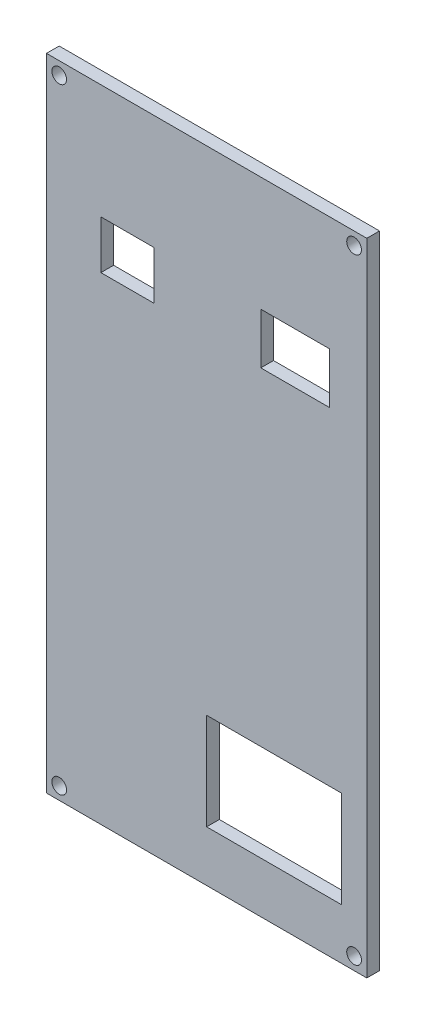
ISO-10303-21;
HEADER;
FILE_DESCRIPTION(('STEP AP214'),'2;1');
FILE_NAME('part.step','',(''),(''),'','','');
FILE_SCHEMA(('AUTOMOTIVE_DESIGN { 1 0 10303 214 1 1 1 1 }'));
ENDSEC;
DATA;
#1=APPLICATION_CONTEXT('core data for automotive mechanical design processes');
#2=APPLICATION_PROTOCOL_DEFINITION('international standard','automotive_design',2000,#1);
#3=PRODUCT_CONTEXT('',#1,'mechanical');
#4=PRODUCT('Part','Part','',(#3));
#5=PRODUCT_RELATED_PRODUCT_CATEGORY('part','',(#4));
#6=PRODUCT_DEFINITION_FORMATION('','',#4);
#7=PRODUCT_DEFINITION_CONTEXT('part definition',#1,'design');
#8=PRODUCT_DEFINITION('design','',#6,#7);
#9=PRODUCT_DEFINITION_SHAPE('','',#8);
#10=(LENGTH_UNIT() NAMED_UNIT(*) SI_UNIT(.MILLI.,.METRE.));
#11=(NAMED_UNIT(*) PLANE_ANGLE_UNIT() SI_UNIT($,.RADIAN.));
#12=(NAMED_UNIT(*) SI_UNIT($,.STERADIAN.) SOLID_ANGLE_UNIT());
#13=UNCERTAINTY_MEASURE_WITH_UNIT(LENGTH_MEASURE(1.E-05),#10,'distance_accuracy_value','');
#14=(GEOMETRIC_REPRESENTATION_CONTEXT(3) GLOBAL_UNCERTAINTY_ASSIGNED_CONTEXT((#13)) GLOBAL_UNIT_ASSIGNED_CONTEXT((#10,
#11,#12)) REPRESENTATION_CONTEXT('',''));
#15=CARTESIAN_POINT('',(0.,0.,0.));
#16=DIRECTION('',(0.,0.,1.));
#17=DIRECTION('',(1.,0.,0.));
#18=AXIS2_PLACEMENT_3D('',#15,#16,#17);
#19=CARTESIAN_POINT('',(0.,63.,52.));
#20=DIRECTION('',(0.,-1.,0.));
#21=DIRECTION('',(0.,0.,-1.));
#22=AXIS2_PLACEMENT_3D('',#19,#20,#21);
#23=PLANE('',#22);
#24=DIRECTION('',(0.,0.,-1.));
#25=VECTOR('',#24,1.);
#26=CARTESIAN_POINT('',(31.5,63.,52.));
#27=LINE('',#26,#25);
#28=CARTESIAN_POINT('',(31.5,63.,54.5));
#29=VERTEX_POINT('',#28);
#30=CARTESIAN_POINT('',(31.5,63.,52.));
#31=VERTEX_POINT('',#30);
#32=EDGE_CURVE('E11',#29,#31,#27,.T.);
#33=ORIENTED_EDGE('',*,*,#32,.T.);
#34=DIRECTION('',(1.,0.,0.));
#35=VECTOR('',#34,1.);
#36=CARTESIAN_POINT('',(-31.5,63.,52.));
#37=LINE('',#36,#35);
#38=CARTESIAN_POINT('',(-31.5,63.,52.));
#39=VERTEX_POINT('',#38);
#40=EDGE_CURVE('E167',#39,#31,#37,.T.);
#41=ORIENTED_EDGE('',*,*,#40,.F.);
#42=DIRECTION('',(0.,0.,-1.));
#43=VECTOR('',#42,1.);
#44=CARTESIAN_POINT('',(-31.5,63.,52.));
#45=LINE('',#44,#43);
#46=CARTESIAN_POINT('',(-31.5,63.,54.5));
#47=VERTEX_POINT('',#46);
#48=EDGE_CURVE('E53',#47,#39,#45,.T.);
#49=ORIENTED_EDGE('',*,*,#48,.F.);
#50=DIRECTION('',(-1.,0.,0.));
#51=VECTOR('',#50,1.);
#52=CARTESIAN_POINT('',(-31.5,63.,54.5));
#53=LINE('',#52,#51);
#54=EDGE_CURVE('E195',#29,#47,#53,.T.);
#55=ORIENTED_EDGE('',*,*,#54,.F.);
#56=EDGE_LOOP('',(#33,#41,#49,#55));
#57=FACE_BOUND('',#56,.T.);
#58=ADVANCED_FACE('F41',(#57),#23,.F.);
#59=CARTESIAN_POINT('',(-29.,-60.5,52.));
#60=DIRECTION('',(0.,0.,-1.));
#61=DIRECTION('',(-1.,0.,0.));
#62=AXIS2_PLACEMENT_3D('',#59,#60,#61);
#63=CYLINDRICAL_SURFACE('',#62,1.45);
#64=CARTESIAN_POINT('',(-29.,-60.5,52.));
#65=DIRECTION('',(0.,0.,1.));
#66=DIRECTION('',(1.,0.,0.));
#67=AXIS2_PLACEMENT_3D('',#64,#65,#66);
#68=CIRCLE('',#67,1.45);
#69=CARTESIAN_POINT('',(-30.45,-60.5,52.));
#70=VERTEX_POINT('',#69);
#71=EDGE_CURVE('E260',#70,#70,#68,.T.);
#72=CARTESIAN_POINT('',(-29.,-60.5,54.5));
#73=DIRECTION('',(0.,0.,1.));
#74=DIRECTION('',(1.,0.,0.));
#75=AXIS2_PLACEMENT_3D('',#72,#73,#74);
#76=CIRCLE('',#75,1.45);
#77=CARTESIAN_POINT('',(-30.45,-60.5,54.5));
#78=VERTEX_POINT('',#77);
#79=EDGE_CURVE('E256',#78,#78,#76,.T.);
#80=CARTESIAN_POINT('',(-30.45,-60.5,52.));
#81=CARTESIAN_POINT('',(-30.45,-60.5,52.0260416666667));
#82=CARTESIAN_POINT('',(-30.45,-60.5,52.0520833333333));
#83=CARTESIAN_POINT('',(-30.45,-60.5,52.1041666666667));
#84=CARTESIAN_POINT('',(-30.45,-60.5,52.1302083333333));
#85=CARTESIAN_POINT('',(-30.45,-60.5,52.1822916666667));
#86=CARTESIAN_POINT('',(-30.45,-60.5,52.2083333333333));
#87=CARTESIAN_POINT('',(-30.45,-60.5,52.2604166666667));
#88=CARTESIAN_POINT('',(-30.45,-60.5,52.2864583333333));
#89=CARTESIAN_POINT('',(-30.45,-60.5,52.3385416666667));
#90=CARTESIAN_POINT('',(-30.45,-60.5,52.3645833333333));
#91=CARTESIAN_POINT('',(-30.45,-60.5,52.4166666666667));
#92=CARTESIAN_POINT('',(-30.45,-60.5,52.4427083333333));
#93=CARTESIAN_POINT('',(-30.45,-60.5,52.4947916666667));
#94=CARTESIAN_POINT('',(-30.45,-60.5,52.5208333333333));
#95=CARTESIAN_POINT('',(-30.45,-60.5,52.5729166666667));
#96=CARTESIAN_POINT('',(-30.45,-60.5,52.5989583333333));
#97=CARTESIAN_POINT('',(-30.45,-60.5,52.6510416666667));
#98=CARTESIAN_POINT('',(-30.45,-60.5,52.6770833333333));
#99=CARTESIAN_POINT('',(-30.45,-60.5,52.7291666666667));
#100=CARTESIAN_POINT('',(-30.45,-60.5,52.7552083333333));
#101=CARTESIAN_POINT('',(-30.45,-60.5,52.8072916666667));
#102=CARTESIAN_POINT('',(-30.45,-60.5,52.8333333333333));
#103=CARTESIAN_POINT('',(-30.45,-60.5,52.8854166666667));
#104=CARTESIAN_POINT('',(-30.45,-60.5,52.9114583333333));
#105=CARTESIAN_POINT('',(-30.45,-60.5,52.9635416666667));
#106=CARTESIAN_POINT('',(-30.45,-60.5,52.9895833333333));
#107=CARTESIAN_POINT('',(-30.45,-60.5,53.0416666666667));
#108=CARTESIAN_POINT('',(-30.45,-60.5,53.0677083333333));
#109=CARTESIAN_POINT('',(-30.45,-60.5,53.1197916666667));
#110=CARTESIAN_POINT('',(-30.45,-60.5,53.1458333333333));
#111=CARTESIAN_POINT('',(-30.45,-60.5,53.1979166666667));
#112=CARTESIAN_POINT('',(-30.45,-60.5,53.2239583333333));
#113=CARTESIAN_POINT('',(-30.45,-60.5,53.2760416666667));
#114=CARTESIAN_POINT('',(-30.45,-60.5,53.3020833333333));
#115=CARTESIAN_POINT('',(-30.45,-60.5,53.3541666666667));
#116=CARTESIAN_POINT('',(-30.45,-60.5,53.3802083333333));
#117=CARTESIAN_POINT('',(-30.45,-60.5,53.4322916666667));
#118=CARTESIAN_POINT('',(-30.45,-60.5,53.4583333333333));
#119=CARTESIAN_POINT('',(-30.45,-60.5,53.5104166666667));
#120=CARTESIAN_POINT('',(-30.45,-60.5,53.5364583333333));
#121=CARTESIAN_POINT('',(-30.45,-60.5,53.5885416666667));
#122=CARTESIAN_POINT('',(-30.45,-60.5,53.6145833333333));
#123=CARTESIAN_POINT('',(-30.45,-60.5,53.6666666666667));
#124=CARTESIAN_POINT('',(-30.45,-60.5,53.6927083333333));
#125=CARTESIAN_POINT('',(-30.45,-60.5,53.7447916666667));
#126=CARTESIAN_POINT('',(-30.45,-60.5,53.7708333333333));
#127=CARTESIAN_POINT('',(-30.45,-60.5,53.8229166666667));
#128=CARTESIAN_POINT('',(-30.45,-60.5,53.8489583333333));
#129=CARTESIAN_POINT('',(-30.45,-60.5,53.9010416666667));
#130=CARTESIAN_POINT('',(-30.45,-60.5,53.9270833333333));
#131=CARTESIAN_POINT('',(-30.45,-60.5,53.9791666666667));
#132=CARTESIAN_POINT('',(-30.45,-60.5,54.0052083333333));
#133=CARTESIAN_POINT('',(-30.45,-60.5,54.0572916666667));
#134=CARTESIAN_POINT('',(-30.45,-60.5,54.0833333333333));
#135=CARTESIAN_POINT('',(-30.45,-60.5,54.1354166666667));
#136=CARTESIAN_POINT('',(-30.45,-60.5,54.1614583333333));
#137=CARTESIAN_POINT('',(-30.45,-60.5,54.2135416666667));
#138=CARTESIAN_POINT('',(-30.45,-60.5,54.2395833333333));
#139=CARTESIAN_POINT('',(-30.45,-60.5,54.2916666666667));
#140=CARTESIAN_POINT('',(-30.45,-60.5,54.3177083333333));
#141=CARTESIAN_POINT('',(-30.45,-60.5,54.3697916666667));
#142=CARTESIAN_POINT('',(-30.45,-60.5,54.3958333333333));
#143=CARTESIAN_POINT('',(-30.45,-60.5,54.4479166666667));
#144=CARTESIAN_POINT('',(-30.45,-60.5,54.4739583333333));
#145=CARTESIAN_POINT('',(-30.45,-60.5,54.5));
#146=B_SPLINE_CURVE_WITH_KNOTS('',3,(#80,#81,#82,#83,#84,#85,#86,#87,#88,#89,#90,#91,#92,#93,
#94,#95,#96,#97,#98,#99,#100,#101,#102,#103,#104,#105,#106,#107,#108,#109,#110,#111,#112,#113,
#114,#115,#116,#117,#118,#119,#120,#121,#122,#123,#124,#125,#126,#127,#128,#129,#130,#131,#132,
#133,#134,#135,#136,#137,#138,#139,#140,#141,#142,#143,#144,#145),.UNSPECIFIED.,.F.,.F.,(4,2,2,
2,2,2,2,2,2,2,2,2,2,2,2,2,2,2,2,2,2,2,2,2,2,2,2,2,2,2,2,2,4),(0.,0.0781249999999983,
0.156249999999997,0.234374999999995,0.3125,0.390624999999999,0.468749999999997,
0.546874999999995,0.625000000000001,0.703124999999999,0.781249999999997,0.859374999999996,
0.937500000000001,1.015625,1.09375,1.171875,1.25,1.328125,1.40625,1.484375,1.5625,1.640625,
1.71875,1.796875,1.875,1.953125,2.03125,2.109375,2.1875,2.265625,2.34375,2.421875,2.5),.UNSPECIFIED.);
#147=EDGE_CURVE('BSEAM453',#70,#78,#146,.T.);
#148=ORIENTED_EDGE('',*,*,#71,.F.);
#149=ORIENTED_EDGE('',*,*,#79,.T.);
#150=ORIENTED_EDGE('',*,*,#147,.T.);
#151=ORIENTED_EDGE('',*,*,#147,.F.);
#152=EDGE_LOOP('',(#148,#150,#149,#151));
#153=FACE_BOUND('',#152,.T.);
#154=ADVANCED_FACE('F453',(#153),#63,.F.);
#155=CARTESIAN_POINT('',(31.5,0.,52.));
#156=DIRECTION('',(1.,0.,0.));
#157=DIRECTION('',(0.,0.,-1.));
#158=AXIS2_PLACEMENT_3D('',#155,#156,#157);
#159=PLANE('',#158);
#160=DIRECTION('',(0.,-1.,0.));
#161=VECTOR('',#160,1.);
#162=CARTESIAN_POINT('',(31.5,0.,52.));
#163=LINE('',#162,#161);
#164=CARTESIAN_POINT('',(31.5,-63.,52.));
#165=VERTEX_POINT('',#164);
#166=EDGE_CURVE('E61',#31,#165,#163,.T.);
#167=ORIENTED_EDGE('',*,*,#166,.F.);
#168=ORIENTED_EDGE('',*,*,#32,.F.);
#169=DIRECTION('',(0.,1.,0.));
#170=VECTOR('',#169,1.);
#171=CARTESIAN_POINT('',(31.5,63.,54.5));
#172=LINE('',#171,#170);
#173=CARTESIAN_POINT('',(31.5,-63.,54.5));
#174=VERTEX_POINT('',#173);
#175=EDGE_CURVE('E239',#174,#29,#172,.T.);
#176=ORIENTED_EDGE('',*,*,#175,.F.);
#177=DIRECTION('',(0.,0.,-1.));
#178=VECTOR('',#177,1.);
#179=CARTESIAN_POINT('',(31.5,-63.,52.));
#180=LINE('',#179,#178);
#181=EDGE_CURVE('E187',#174,#165,#180,.T.);
#182=ORIENTED_EDGE('',*,*,#181,.T.);
#183=EDGE_LOOP('',(#167,#168,#176,#182));
#184=FACE_BOUND('',#183,.T.);
#185=ADVANCED_FACE('F411',(#184),#159,.T.);
#186=CARTESIAN_POINT('',(-31.5,0.,52.));
#187=DIRECTION('',(1.,0.,0.));
#188=DIRECTION('',(0.,0.,-1.));
#189=AXIS2_PLACEMENT_3D('',#186,#187,#188);
#190=PLANE('',#189);
#191=ORIENTED_EDGE('',*,*,#48,.T.);
#192=DIRECTION('',(0.,-1.,0.));
#193=VECTOR('',#192,1.);
#194=CARTESIAN_POINT('',(-31.5,0.,52.));
#195=LINE('',#194,#193);
#196=CARTESIAN_POINT('',(-31.5,-63.,52.));
#197=VERTEX_POINT('',#196);
#198=EDGE_CURVE('E164',#39,#197,#195,.T.);
#199=ORIENTED_EDGE('',*,*,#198,.T.);
#200=DIRECTION('',(0.,0.,-1.));
#201=VECTOR('',#200,1.);
#202=CARTESIAN_POINT('',(-31.5,-63.,52.));
#203=LINE('',#202,#201);
#204=CARTESIAN_POINT('',(-31.5,-63.,54.5));
#205=VERTEX_POINT('',#204);
#206=EDGE_CURVE('E184',#205,#197,#203,.T.);
#207=ORIENTED_EDGE('',*,*,#206,.F.);
#208=DIRECTION('',(0.,-1.,0.));
#209=VECTOR('',#208,1.);
#210=CARTESIAN_POINT('',(-31.5,63.,54.5));
#211=LINE('',#210,#209);
#212=EDGE_CURVE('E182',#47,#205,#211,.T.);
#213=ORIENTED_EDGE('',*,*,#212,.F.);
#214=EDGE_LOOP('',(#191,#199,#207,#213));
#215=FACE_BOUND('',#214,.T.);
#216=ADVANCED_FACE('F180',(#215),#190,.F.);
#217=CARTESIAN_POINT('',(29.,-60.5,52.));
#218=DIRECTION('',(0.,0.,-1.));
#219=DIRECTION('',(-1.,0.,0.));
#220=AXIS2_PLACEMENT_3D('',#217,#218,#219);
#221=CYLINDRICAL_SURFACE('',#220,1.45);
#222=CARTESIAN_POINT('',(29.,-60.5,52.));
#223=DIRECTION('',(0.,0.,1.));
#224=DIRECTION('',(1.,0.,0.));
#225=AXIS2_PLACEMENT_3D('',#222,#223,#224);
#226=CIRCLE('',#225,1.45);
#227=CARTESIAN_POINT('',(27.55,-60.5,52.));
#228=VERTEX_POINT('',#227);
#229=EDGE_CURVE('E268',#228,#228,#226,.T.);
#230=CARTESIAN_POINT('',(29.,-60.5,54.5));
#231=DIRECTION('',(0.,0.,1.));
#232=DIRECTION('',(1.,0.,0.));
#233=AXIS2_PLACEMENT_3D('',#230,#231,#232);
#234=CIRCLE('',#233,1.45);
#235=CARTESIAN_POINT('',(27.55,-60.5,54.5));
#236=VERTEX_POINT('',#235);
#237=EDGE_CURVE('E264',#236,#236,#234,.T.);
#238=CARTESIAN_POINT('',(27.55,-60.5,52.));
#239=CARTESIAN_POINT('',(27.55,-60.5,52.0260416666667));
#240=CARTESIAN_POINT('',(27.55,-60.5,52.0520833333333));
#241=CARTESIAN_POINT('',(27.55,-60.5,52.1041666666667));
#242=CARTESIAN_POINT('',(27.55,-60.5,52.1302083333333));
#243=CARTESIAN_POINT('',(27.55,-60.5,52.1822916666667));
#244=CARTESIAN_POINT('',(27.55,-60.5,52.2083333333333));
#245=CARTESIAN_POINT('',(27.55,-60.5,52.2604166666667));
#246=CARTESIAN_POINT('',(27.55,-60.5,52.2864583333333));
#247=CARTESIAN_POINT('',(27.55,-60.5,52.3385416666667));
#248=CARTESIAN_POINT('',(27.55,-60.5,52.3645833333333));
#249=CARTESIAN_POINT('',(27.55,-60.5,52.4166666666667));
#250=CARTESIAN_POINT('',(27.55,-60.5,52.4427083333333));
#251=CARTESIAN_POINT('',(27.55,-60.5,52.4947916666667));
#252=CARTESIAN_POINT('',(27.55,-60.5,52.5208333333333));
#253=CARTESIAN_POINT('',(27.55,-60.5,52.5729166666667));
#254=CARTESIAN_POINT('',(27.55,-60.5,52.5989583333333));
#255=CARTESIAN_POINT('',(27.55,-60.5,52.6510416666667));
#256=CARTESIAN_POINT('',(27.55,-60.5,52.6770833333333));
#257=CARTESIAN_POINT('',(27.55,-60.5,52.7291666666667));
#258=CARTESIAN_POINT('',(27.55,-60.5,52.7552083333333));
#259=CARTESIAN_POINT('',(27.55,-60.5,52.8072916666667));
#260=CARTESIAN_POINT('',(27.55,-60.5,52.8333333333333));
#261=CARTESIAN_POINT('',(27.55,-60.5,52.8854166666667));
#262=CARTESIAN_POINT('',(27.55,-60.5,52.9114583333333));
#263=CARTESIAN_POINT('',(27.55,-60.5,52.9635416666667));
#264=CARTESIAN_POINT('',(27.55,-60.5,52.9895833333333));
#265=CARTESIAN_POINT('',(27.55,-60.5,53.0416666666667));
#266=CARTESIAN_POINT('',(27.55,-60.5,53.0677083333333));
#267=CARTESIAN_POINT('',(27.55,-60.5,53.1197916666667));
#268=CARTESIAN_POINT('',(27.55,-60.5,53.1458333333333));
#269=CARTESIAN_POINT('',(27.55,-60.5,53.1979166666667));
#270=CARTESIAN_POINT('',(27.55,-60.5,53.2239583333333));
#271=CARTESIAN_POINT('',(27.55,-60.5,53.2760416666667));
#272=CARTESIAN_POINT('',(27.55,-60.5,53.3020833333333));
#273=CARTESIAN_POINT('',(27.55,-60.5,53.3541666666667));
#274=CARTESIAN_POINT('',(27.55,-60.5,53.3802083333333));
#275=CARTESIAN_POINT('',(27.55,-60.5,53.4322916666667));
#276=CARTESIAN_POINT('',(27.55,-60.5,53.4583333333333));
#277=CARTESIAN_POINT('',(27.55,-60.5,53.5104166666667));
#278=CARTESIAN_POINT('',(27.55,-60.5,53.5364583333333));
#279=CARTESIAN_POINT('',(27.55,-60.5,53.5885416666667));
#280=CARTESIAN_POINT('',(27.55,-60.5,53.6145833333333));
#281=CARTESIAN_POINT('',(27.55,-60.5,53.6666666666667));
#282=CARTESIAN_POINT('',(27.55,-60.5,53.6927083333333));
#283=CARTESIAN_POINT('',(27.55,-60.5,53.7447916666667));
#284=CARTESIAN_POINT('',(27.55,-60.5,53.7708333333333));
#285=CARTESIAN_POINT('',(27.55,-60.5,53.8229166666667));
#286=CARTESIAN_POINT('',(27.55,-60.5,53.8489583333333));
#287=CARTESIAN_POINT('',(27.55,-60.5,53.9010416666667));
#288=CARTESIAN_POINT('',(27.55,-60.5,53.9270833333333));
#289=CARTESIAN_POINT('',(27.55,-60.5,53.9791666666667));
#290=CARTESIAN_POINT('',(27.55,-60.5,54.0052083333333));
#291=CARTESIAN_POINT('',(27.55,-60.5,54.0572916666667));
#292=CARTESIAN_POINT('',(27.55,-60.5,54.0833333333333));
#293=CARTESIAN_POINT('',(27.55,-60.5,54.1354166666667));
#294=CARTESIAN_POINT('',(27.55,-60.5,54.1614583333333));
#295=CARTESIAN_POINT('',(27.55,-60.5,54.2135416666667));
#296=CARTESIAN_POINT('',(27.55,-60.5,54.2395833333333));
#297=CARTESIAN_POINT('',(27.55,-60.5,54.2916666666667));
#298=CARTESIAN_POINT('',(27.55,-60.5,54.3177083333333));
#299=CARTESIAN_POINT('',(27.55,-60.5,54.3697916666667));
#300=CARTESIAN_POINT('',(27.55,-60.5,54.3958333333333));
#301=CARTESIAN_POINT('',(27.55,-60.5,54.4479166666667));
#302=CARTESIAN_POINT('',(27.55,-60.5,54.4739583333333));
#303=CARTESIAN_POINT('',(27.55,-60.5,54.5));
#304=B_SPLINE_CURVE_WITH_KNOTS('',3,(#238,#239,#240,#241,#242,#243,#244,#245,#246,#247,#248,
#249,#250,#251,#252,#253,#254,#255,#256,#257,#258,#259,#260,#261,#262,#263,#264,#265,#266,#267,
#268,#269,#270,#271,#272,#273,#274,#275,#276,#277,#278,#279,#280,#281,#282,#283,#284,#285,#286,
#287,#288,#289,#290,#291,#292,#293,#294,#295,#296,#297,#298,#299,#300,#301,#302,#303),
.UNSPECIFIED.,.F.,.F.,(4,2,2,2,2,2,2,2,2,2,2,2,2,2,2,2,2,2,2,2,2,2,2,2,2,2,2,2,2,2,2,2,4),(0.,
0.0781249999999983,0.156249999999997,0.234374999999995,0.3125,0.390624999999999,
0.468749999999997,0.546874999999995,0.625000000000001,0.703124999999999,0.781249999999997,
0.859374999999996,0.937500000000001,1.015625,1.09375,1.171875,1.25,1.328125,1.40625,1.484375,
1.5625,1.640625,1.71875,1.796875,1.875,1.953125,2.03125,2.109375,2.1875,2.265625,2.34375,
2.421875,2.5),.UNSPECIFIED.);
#305=EDGE_CURVE('BSEAM43',#228,#236,#304,.T.);
#306=ORIENTED_EDGE('',*,*,#229,.F.);
#307=ORIENTED_EDGE('',*,*,#237,.T.);
#308=ORIENTED_EDGE('',*,*,#305,.T.);
#309=ORIENTED_EDGE('',*,*,#305,.F.);
#310=EDGE_LOOP('',(#306,#308,#307,#309));
#311=FACE_BOUND('',#310,.T.);
#312=ADVANCED_FACE('F43',(#311),#221,.F.);
#313=CARTESIAN_POINT('',(29.,60.5,52.));
#314=DIRECTION('',(0.,0.,-1.));
#315=DIRECTION('',(-1.,0.,0.));
#316=AXIS2_PLACEMENT_3D('',#313,#314,#315);
#317=CYLINDRICAL_SURFACE('',#316,1.45);
#318=CARTESIAN_POINT('',(29.,60.5,52.));
#319=DIRECTION('',(0.,0.,1.));
#320=DIRECTION('',(1.,0.,0.));
#321=AXIS2_PLACEMENT_3D('',#318,#319,#320);
#322=CIRCLE('',#321,1.45);
#323=CARTESIAN_POINT('',(27.55,60.5,52.));
#324=VERTEX_POINT('',#323);
#325=EDGE_CURVE('E252',#324,#324,#322,.T.);
#326=CARTESIAN_POINT('',(29.,60.5,54.5));
#327=DIRECTION('',(0.,0.,1.));
#328=DIRECTION('',(1.,0.,0.));
#329=AXIS2_PLACEMENT_3D('',#326,#327,#328);
#330=CIRCLE('',#329,1.45);
#331=CARTESIAN_POINT('',(27.55,60.5,54.5));
#332=VERTEX_POINT('',#331);
#333=EDGE_CURVE('E200',#332,#332,#330,.T.);
#334=CARTESIAN_POINT('',(27.55,60.5,52.));
#335=CARTESIAN_POINT('',(27.55,60.5,52.0260416666667));
#336=CARTESIAN_POINT('',(27.55,60.5,52.0520833333333));
#337=CARTESIAN_POINT('',(27.55,60.5,52.1041666666667));
#338=CARTESIAN_POINT('',(27.55,60.5,52.1302083333333));
#339=CARTESIAN_POINT('',(27.55,60.5,52.1822916666667));
#340=CARTESIAN_POINT('',(27.55,60.5,52.2083333333333));
#341=CARTESIAN_POINT('',(27.55,60.5,52.2604166666667));
#342=CARTESIAN_POINT('',(27.55,60.5,52.2864583333333));
#343=CARTESIAN_POINT('',(27.55,60.5,52.3385416666667));
#344=CARTESIAN_POINT('',(27.55,60.5,52.3645833333333));
#345=CARTESIAN_POINT('',(27.55,60.5,52.4166666666667));
#346=CARTESIAN_POINT('',(27.55,60.5,52.4427083333333));
#347=CARTESIAN_POINT('',(27.55,60.5,52.4947916666667));
#348=CARTESIAN_POINT('',(27.55,60.5,52.5208333333333));
#349=CARTESIAN_POINT('',(27.55,60.5,52.5729166666667));
#350=CARTESIAN_POINT('',(27.55,60.5,52.5989583333333));
#351=CARTESIAN_POINT('',(27.55,60.5,52.6510416666667));
#352=CARTESIAN_POINT('',(27.55,60.5,52.6770833333333));
#353=CARTESIAN_POINT('',(27.55,60.5,52.7291666666667));
#354=CARTESIAN_POINT('',(27.55,60.5,52.7552083333333));
#355=CARTESIAN_POINT('',(27.55,60.5,52.8072916666667));
#356=CARTESIAN_POINT('',(27.55,60.5,52.8333333333333));
#357=CARTESIAN_POINT('',(27.55,60.5,52.8854166666667));
#358=CARTESIAN_POINT('',(27.55,60.5,52.9114583333333));
#359=CARTESIAN_POINT('',(27.55,60.5,52.9635416666667));
#360=CARTESIAN_POINT('',(27.55,60.5,52.9895833333333));
#361=CARTESIAN_POINT('',(27.55,60.5,53.0416666666667));
#362=CARTESIAN_POINT('',(27.55,60.5,53.0677083333333));
#363=CARTESIAN_POINT('',(27.55,60.5,53.1197916666667));
#364=CARTESIAN_POINT('',(27.55,60.5,53.1458333333333));
#365=CARTESIAN_POINT('',(27.55,60.5,53.1979166666667));
#366=CARTESIAN_POINT('',(27.55,60.5,53.2239583333333));
#367=CARTESIAN_POINT('',(27.55,60.5,53.2760416666667));
#368=CARTESIAN_POINT('',(27.55,60.5,53.3020833333333));
#369=CARTESIAN_POINT('',(27.55,60.5,53.3541666666667));
#370=CARTESIAN_POINT('',(27.55,60.5,53.3802083333333));
#371=CARTESIAN_POINT('',(27.55,60.5,53.4322916666667));
#372=CARTESIAN_POINT('',(27.55,60.5,53.4583333333333));
#373=CARTESIAN_POINT('',(27.55,60.5,53.5104166666667));
#374=CARTESIAN_POINT('',(27.55,60.5,53.5364583333333));
#375=CARTESIAN_POINT('',(27.55,60.5,53.5885416666667));
#376=CARTESIAN_POINT('',(27.55,60.5,53.6145833333333));
#377=CARTESIAN_POINT('',(27.55,60.5,53.6666666666667));
#378=CARTESIAN_POINT('',(27.55,60.5,53.6927083333333));
#379=CARTESIAN_POINT('',(27.55,60.5,53.7447916666667));
#380=CARTESIAN_POINT('',(27.55,60.5,53.7708333333333));
#381=CARTESIAN_POINT('',(27.55,60.5,53.8229166666667));
#382=CARTESIAN_POINT('',(27.55,60.5,53.8489583333333));
#383=CARTESIAN_POINT('',(27.55,60.5,53.9010416666667));
#384=CARTESIAN_POINT('',(27.55,60.5,53.9270833333333));
#385=CARTESIAN_POINT('',(27.55,60.5,53.9791666666667));
#386=CARTESIAN_POINT('',(27.55,60.5,54.0052083333333));
#387=CARTESIAN_POINT('',(27.55,60.5,54.0572916666667));
#388=CARTESIAN_POINT('',(27.55,60.5,54.0833333333333));
#389=CARTESIAN_POINT('',(27.55,60.5,54.1354166666667));
#390=CARTESIAN_POINT('',(27.55,60.5,54.1614583333333));
#391=CARTESIAN_POINT('',(27.55,60.5,54.2135416666667));
#392=CARTESIAN_POINT('',(27.55,60.5,54.2395833333333));
#393=CARTESIAN_POINT('',(27.55,60.5,54.2916666666667));
#394=CARTESIAN_POINT('',(27.55,60.5,54.3177083333333));
#395=CARTESIAN_POINT('',(27.55,60.5,54.3697916666667));
#396=CARTESIAN_POINT('',(27.55,60.5,54.3958333333333));
#397=CARTESIAN_POINT('',(27.55,60.5,54.4479166666667));
#398=CARTESIAN_POINT('',(27.55,60.5,54.4739583333333));
#399=CARTESIAN_POINT('',(27.55,60.5,54.5));
#400=B_SPLINE_CURVE_WITH_KNOTS('',3,(#334,#335,#336,#337,#338,#339,#340,#341,#342,#343,#344,
#345,#346,#347,#348,#349,#350,#351,#352,#353,#354,#355,#356,#357,#358,#359,#360,#361,#362,#363,
#364,#365,#366,#367,#368,#369,#370,#371,#372,#373,#374,#375,#376,#377,#378,#379,#380,#381,#382,
#383,#384,#385,#386,#387,#388,#389,#390,#391,#392,#393,#394,#395,#396,#397,#398,#399),
.UNSPECIFIED.,.F.,.F.,(4,2,2,2,2,2,2,2,2,2,2,2,2,2,2,2,2,2,2,2,2,2,2,2,2,2,2,2,2,2,2,2,4),(0.,
0.0781249999999983,0.156249999999997,0.234374999999995,0.3125,0.390624999999999,
0.468749999999997,0.546874999999995,0.625000000000001,0.703124999999999,0.781249999999997,
0.859374999999996,0.937500000000001,1.015625,1.09375,1.171875,1.25,1.328125,1.40625,1.484375,
1.5625,1.640625,1.71875,1.796875,1.875,1.953125,2.03125,2.109375,2.1875,2.265625,2.34375,
2.421875,2.5),.UNSPECIFIED.);
#401=EDGE_CURVE('BSEAM462',#324,#332,#400,.T.);
#402=ORIENTED_EDGE('',*,*,#325,.F.);
#403=ORIENTED_EDGE('',*,*,#333,.T.);
#404=ORIENTED_EDGE('',*,*,#401,.T.);
#405=ORIENTED_EDGE('',*,*,#401,.F.);
#406=EDGE_LOOP('',(#402,#404,#403,#405));
#407=FACE_BOUND('',#406,.T.);
#408=ADVANCED_FACE('F462',(#407),#317,.F.);
#409=CARTESIAN_POINT('',(0.,-63.,52.));
#410=DIRECTION('',(0.,-1.,0.));
#411=DIRECTION('',(1.,0.,0.));
#412=AXIS2_PLACEMENT_3D('',#409,#410,#411);
#413=PLANE('',#412);
#414=DIRECTION('',(1.,0.,0.));
#415=VECTOR('',#414,1.);
#416=CARTESIAN_POINT('',(-31.5,-63.,52.));
#417=LINE('',#416,#415);
#418=EDGE_CURVE('E168',#197,#165,#417,.T.);
#419=ORIENTED_EDGE('',*,*,#418,.T.);
#420=ORIENTED_EDGE('',*,*,#181,.F.);
#421=DIRECTION('',(1.,0.,0.));
#422=VECTOR('',#421,1.);
#423=CARTESIAN_POINT('',(-31.5,-63.,54.5));
#424=LINE('',#423,#422);
#425=EDGE_CURVE('E243',#205,#174,#424,.T.);
#426=ORIENTED_EDGE('',*,*,#425,.F.);
#427=ORIENTED_EDGE('',*,*,#206,.T.);
#428=EDGE_LOOP('',(#419,#420,#426,#427));
#429=FACE_BOUND('',#428,.T.);
#430=ADVANCED_FACE('F225',(#429),#413,.T.);
#431=CARTESIAN_POINT('',(0.,0.,52.));
#432=DIRECTION('',(0.,0.,1.));
#433=DIRECTION('',(1.,0.,0.));
#434=AXIS2_PLACEMENT_3D('',#431,#432,#433);
#435=PLANE('',#434);
#436=ORIENTED_EDGE('',*,*,#71,.T.);
#437=EDGE_LOOP('',(#436));
#438=FACE_BOUND('',#437,.T.);
#439=ORIENTED_EDGE('',*,*,#229,.T.);
#440=EDGE_LOOP('',(#439));
#441=FACE_BOUND('',#440,.T.);
#442=CARTESIAN_POINT('',(-29.,59.0594917990501,52.));
#443=CARTESIAN_POINT('',(-28.9762820108698,59.0594775759116,52.));
#444=CARTESIAN_POINT('',(-28.9525626025283,59.0600349471193,52.));
#445=CARTESIAN_POINT('',(-28.9053359188717,59.0623026826512,52.));
#446=CARTESIAN_POINT('',(-28.8818282760496,59.0640054203817,52.));
#447=CARTESIAN_POINT('',(-28.8350248506873,59.0685634541196,52.));
#448=CARTESIAN_POINT('',(-28.8117285926708,59.0714138508072,52.));
#449=CARTESIAN_POINT('',(-28.7653481613158,59.0782637919545,52.));
#450=CARTESIAN_POINT('',(-28.7422636832016,59.0822612722179,52.));
#451=CARTESIAN_POINT('',(-28.6963065647439,59.0914027183243,52.));
#452=CARTESIAN_POINT('',(-28.6734340791419,59.0965474620115,52.));
#453=CARTESIAN_POINT('',(-28.6279003752758,59.1079803374603,52.));
#454=CARTESIAN_POINT('',(-28.6052400475159,59.1142720137773,52.));
#455=CARTESIAN_POINT('',(-28.5601301301537,59.1279967762076,52.));
#456=CARTESIAN_POINT('',(-28.5376824168893,59.1354360235993,52.));
#457=CARTESIAN_POINT('',(-28.4929957218756,59.1514505021358,52.));
#458=CARTESIAN_POINT('',(-28.4707598007241,59.1600342625157,52.));
#459=CARTESIAN_POINT('',(-28.4268244845157,59.1782116446218,52.));
#460=CARTESIAN_POINT('',(-28.4051230882468,59.1878004271938,52.));
#461=CARTESIAN_POINT('',(-28.3623585530702,59.2079660967038,52.));
#462=CARTESIAN_POINT('',(-28.3412921492333,59.2185360516124,52.));
#463=CARTESIAN_POINT('',(-28.2997958643521,59.2406586366754,52.));
#464=CARTESIAN_POINT('',(-28.2793636702966,59.2522069269289,52.));
#465=CARTESIAN_POINT('',(-28.239135055909,59.276284305719,52.));
#466=CARTESIAN_POINT('',(-28.2193375639364,59.2888116033098,52.));
#467=CARTESIAN_POINT('',(-28.1803770140826,59.3148442701169,52.));
#468=CARTESIAN_POINT('',(-28.1612143968188,59.3283502986986,52.));
#469=CARTESIAN_POINT('',(-28.1235219087606,59.3563378805704,52.));
#470=CARTESIAN_POINT('',(-28.104994217144,59.3708223678857,52.));
#471=CARTESIAN_POINT('',(-28.068570327793,59.4007652161873,52.));
#472=CARTESIAN_POINT('',(-28.05067822138,59.4162285513785,52.));
#473=CARTESIAN_POINT('',(-28.0155215738796,59.4481248572887,52.));
#474=CARTESIAN_POINT('',(-27.9982631244158,59.464564536765,52.));
#475=CARTESIAN_POINT('',(-27.9646283680298,59.4981715658785,52.));
#476=CARTESIAN_POINT('',(-27.9482483603652,59.5153352105526,52.));
#477=CARTESIAN_POINT('',(-27.9164561492881,59.5503311389498,52.));
#478=CARTESIAN_POINT('',(-27.9010382767004,59.5681582677461,52.));
#479=CARTESIAN_POINT('',(-27.8711666549102,59.6044768119112,52.));
#480=CARTESIAN_POINT('',(-27.856709107958,59.6229651028865,52.));
#481=CARTESIAN_POINT('',(-27.8287567295824,59.6606045250439,52.));
#482=CARTESIAN_POINT('',(-27.8152602227233,59.6797544117053,52.));
#483=CARTESIAN_POINT('',(-27.7892276342461,59.7187150149477,52.));
#484=CARTESIAN_POINT('',(-27.7766922120286,59.738526172084,52.));
#485=CARTESIAN_POINT('',(-27.7525792933085,59.7788076233643,52.));
#486=CARTESIAN_POINT('',(-27.7410049329915,59.7992797942945,52.));
#487=CARTESIAN_POINT('',(-27.7188122204081,59.8408821735059,52.));
#488=CARTESIAN_POINT('',(-27.7081995510096,59.8620154114362,52.));
#489=CARTESIAN_POINT('',(-27.6879254528466,59.9049377143763,52.));
#490=CARTESIAN_POINT('',(-27.6782722223723,59.9267306475716,52.));
#491=CARTESIAN_POINT('',(-27.6600468809722,59.9706768997486,52.));
#492=CARTESIAN_POINT('',(-27.6514711887261,59.992828732918,52.));
#493=CARTESIAN_POINT('',(-27.6354729035736,60.0373722615219,52.));
#494=CARTESIAN_POINT('',(-27.6280427314135,60.0597612308068,52.));
#495=CARTESIAN_POINT('',(-27.6143309286329,60.1047766009403,52.));
#496=CARTESIAN_POINT('',(-27.608044207285,60.1274014503334,52.));
#497=CARTESIAN_POINT('',(-27.5966173363585,60.1728877182474,52.));
#498=CARTESIAN_POINT('',(-27.5914747702167,60.1957485293707,52.));
#499=CARTESIAN_POINT('',(-27.5823333549976,60.2417057159432,52.));
#500=CARTESIAN_POINT('',(-27.5783348948635,60.2648021687427,52.));
#501=CARTESIAN_POINT('',(-27.5714787437428,60.3112300682441,52.));
#502=CARTESIAN_POINT('',(-27.5686242931099,60.334561993198,52.));
#503=CARTESIAN_POINT('',(-27.5640538572868,60.3814602960549,52.));
#504=CARTESIAN_POINT('',(-27.5623439284507,60.405027261743,52.));
#505=CARTESIAN_POINT('',(-27.5600576236962,60.4523963014881,52.));
#506=CARTESIAN_POINT('',(-27.5594899828171,60.4761987988743,52.));
#507=CARTESIAN_POINT('',(-27.5594917990501,60.5,52.));
#508=B_SPLINE_CURVE_WITH_KNOTS('',3,(#442,#443,#444,#445,#446,#447,#448,#449,#450,#451,#452,
#453,#454,#455,#456,#457,#458,#459,#460,#461,#462,#463,#464,#465,#466,#467,#468,#469,#470,#471,
#472,#473,#474,#475,#476,#477,#478,#479,#480,#481,#482,#483,#484,#485,#486,#487,#488,#489,#490,
#491,#492,#493,#494,#495,#496,#497,#498,#499,#500,#501,#502,#503,#504,#505,#506,#507),
.UNSPECIFIED.,.F.,.F.,(4,2,2,2,2,2,2,2,2,2,2,2,2,2,2,2,2,2,2,2,2,2,2,2,2,2,2,2,2,2,2,2,4),(0.,
0.0711487005080444,0.141828275794937,0.212209268271956,0.282464394789013,0.352767299866748,
0.423291275104752,0.494207991504604,0.565686290358631,0.636834990867272,0.707514566154587,
0.777895558631872,0.848150685149015,0.918453590226657,0.988977565464419,1.05989428186384,
1.13137258071728,1.20252128122602,1.27320085651341,1.34358184899074,1.4138369755079,
1.48413988058552,1.55466385582322,1.62558057222255,1.69705887107585,1.76829293950262,
1.83903334742727,1.90945066341614,1.979717808924,2.0500088137083,2.12049753080802,
2.19135635800802,2.26275501216179),.UNSPECIFIED.);
#509=CARTESIAN_POINT('',(-29.,59.0571188496072,52.));
#510=VERTEX_POINT('',#509);
#511=CARTESIAN_POINT('',(-27.5571188492875,60.5,52.));
#512=VERTEX_POINT('',#511);
#513=EDGE_CURVE('E68',#510,#512,#508,.T.);
#514=ORIENTED_EDGE('',*,*,#513,.T.);
#515=CARTESIAN_POINT('',(-27.5594917990501,60.5,52.));
#516=CARTESIAN_POINT('',(-27.5594917990501,60.936563558886,52.));
#517=CARTESIAN_POINT('',(-27.8022612046375,61.3003034768684,52.));
#518=CARTESIAN_POINT('',(-28.0444250238669,61.6631360485084,52.));
#519=CARTESIAN_POINT('',(-28.4487413773104,61.8308560432723,52.));
#520=CARTESIAN_POINT('',(-28.8516722105712,61.9980012914651,52.));
#521=CARTESIAN_POINT('',(-29.2810292087902,61.9128292397918,52.));
#522=CARTESIAN_POINT('',(-29.7089148769939,61.8279490575806,52.));
#523=CARTESIAN_POINT('',(-30.0185931172465,61.5185931172465,52.));
#524=CARTESIAN_POINT('',(-30.3272101452878,61.2102972846593,52.));
#525=CARTESIAN_POINT('',(-30.4128292397918,60.7810292087902,52.));
#526=CARTESIAN_POINT('',(-30.4981549328981,60.353232158213,52.));
#527=CARTESIAN_POINT('',(-30.3308560432723,59.9487413773104,52.));
#528=CARTESIAN_POINT('',(-30.1641304571649,59.5456367143215,52.));
#529=CARTESIAN_POINT('',(-29.8003034768684,59.3022612046375,52.));
#530=CARTESIAN_POINT('',(-29.4373825738658,59.0594917990501,52.));
#531=CARTESIAN_POINT('',(-29.,59.0594917990501,52.));
#532=B_SPLINE_CURVE_WITH_KNOTS('',2,(#515,#516,#517,#518,#519,#520,#521,#522,#523,#524,#525,
#526,#527,#528,#529,#530,#531),.UNSPECIFIED.,.F.,.F.,(3,2,2,2,2,2,2,2,3),(0.,0.125,0.25,0.375,
0.5,0.625,0.75,0.875,1.),.UNSPECIFIED.);
#533=EDGE_CURVE('E190',#512,#510,#532,.T.);
#534=ORIENTED_EDGE('',*,*,#533,.T.);
#535=EDGE_LOOP('',(#514,#534));
#536=FACE_BOUND('',#535,.T.);
#537=DIRECTION('',(0.,-1.,0.));
#538=VECTOR('',#537,1.);
#539=CARTESIAN_POINT('',(-20.8,40.5,52.));
#540=LINE('',#539,#538);
#541=CARTESIAN_POINT('',(-20.8,40.5,52.));
#542=VERTEX_POINT('',#541);
#543=CARTESIAN_POINT('',(-20.8,31.,52.));
#544=VERTEX_POINT('',#543);
#545=EDGE_CURVE('E389',#542,#544,#540,.T.);
#546=ORIENTED_EDGE('',*,*,#545,.T.);
#547=DIRECTION('',(1.,0.,0.));
#548=VECTOR('',#547,1.);
#549=CARTESIAN_POINT('',(-20.8,31.,52.));
#550=LINE('',#549,#548);
#551=CARTESIAN_POINT('',(-10.4,31.,52.));
#552=VERTEX_POINT('',#551);
#553=EDGE_CURVE('E385',#544,#552,#550,.T.);
#554=ORIENTED_EDGE('',*,*,#553,.T.);
#555=DIRECTION('',(0.,1.,0.));
#556=VECTOR('',#555,1.);
#557=CARTESIAN_POINT('',(-10.4,40.5,52.));
#558=LINE('',#557,#556);
#559=CARTESIAN_POINT('',(-10.4,40.5,52.));
#560=VERTEX_POINT('',#559);
#561=EDGE_CURVE('E381',#552,#560,#558,.T.);
#562=ORIENTED_EDGE('',*,*,#561,.T.);
#563=DIRECTION('',(-1.,0.,0.));
#564=VECTOR('',#563,1.);
#565=CARTESIAN_POINT('',(-20.8,40.5,52.));
#566=LINE('',#565,#564);
#567=EDGE_CURVE('E376',#560,#542,#566,.T.);
#568=ORIENTED_EDGE('',*,*,#567,.T.);
#569=EDGE_LOOP('',(#546,#554,#562,#568));
#570=FACE_BOUND('',#569,.T.);
#571=DIRECTION('',(0.,-1.,0.));
#572=VECTOR('',#571,1.);
#573=CARTESIAN_POINT('',(0.,-34.,52.));
#574=LINE('',#573,#572);
#575=CARTESIAN_POINT('',(0.,-34.,52.));
#576=VERTEX_POINT('',#575);
#577=CARTESIAN_POINT('',(0.,-53.,52.));
#578=VERTEX_POINT('',#577);
#579=EDGE_CURVE('E303',#576,#578,#574,.T.);
#580=ORIENTED_EDGE('',*,*,#579,.T.);
#581=DIRECTION('',(1.,0.,0.));
#582=VECTOR('',#581,1.);
#583=CARTESIAN_POINT('',(0.,-53.,52.));
#584=LINE('',#583,#582);
#585=CARTESIAN_POINT('',(26.5,-53.,52.));
#586=VERTEX_POINT('',#585);
#587=EDGE_CURVE('E299',#578,#586,#584,.T.);
#588=ORIENTED_EDGE('',*,*,#587,.T.);
#589=DIRECTION('',(0.,1.,0.));
#590=VECTOR('',#589,1.);
#591=CARTESIAN_POINT('',(26.5,-34.,52.));
#592=LINE('',#591,#590);
#593=CARTESIAN_POINT('',(26.5,-34.,52.));
#594=VERTEX_POINT('',#593);
#595=EDGE_CURVE('E295',#586,#594,#592,.T.);
#596=ORIENTED_EDGE('',*,*,#595,.T.);
#597=DIRECTION('',(-1.,0.,0.));
#598=VECTOR('',#597,1.);
#599=CARTESIAN_POINT('',(0.,-34.,52.));
#600=LINE('',#599,#598);
#601=EDGE_CURVE('E290',#594,#576,#600,.T.);
#602=ORIENTED_EDGE('',*,*,#601,.T.);
#603=EDGE_LOOP('',(#580,#588,#596,#602));
#604=FACE_BOUND('',#603,.T.);
#605=DIRECTION('',(0.,-1.,0.));
#606=VECTOR('',#605,1.);
#607=CARTESIAN_POINT('',(10.6495714356207,40.5,52.));
#608=LINE('',#607,#606);
#609=CARTESIAN_POINT('',(10.6495714356207,40.5,52.));
#610=VERTEX_POINT('',#609);
#611=CARTESIAN_POINT('',(10.6495714356207,30.5,52.));
#612=VERTEX_POINT('',#611);
#613=EDGE_CURVE('E346',#610,#612,#608,.T.);
#614=ORIENTED_EDGE('',*,*,#613,.T.);
#615=DIRECTION('',(1.,0.,0.));
#616=VECTOR('',#615,1.);
#617=CARTESIAN_POINT('',(10.6495714356207,30.5,52.));
#618=LINE('',#617,#616);
#619=CARTESIAN_POINT('',(24.1495714356207,30.5,52.));
#620=VERTEX_POINT('',#619);
#621=EDGE_CURVE('E342',#612,#620,#618,.T.);
#622=ORIENTED_EDGE('',*,*,#621,.T.);
#623=DIRECTION('',(0.,1.,0.));
#624=VECTOR('',#623,1.);
#625=CARTESIAN_POINT('',(24.1495714356207,40.5,52.));
#626=LINE('',#625,#624);
#627=CARTESIAN_POINT('',(24.1495714356207,40.5,52.));
#628=VERTEX_POINT('',#627);
#629=EDGE_CURVE('E338',#620,#628,#626,.T.);
#630=ORIENTED_EDGE('',*,*,#629,.T.);
#631=DIRECTION('',(-1.,0.,0.));
#632=VECTOR('',#631,1.);
#633=CARTESIAN_POINT('',(10.6495714356207,40.5,52.));
#634=LINE('',#633,#632);
#635=EDGE_CURVE('E333',#628,#610,#634,.T.);
#636=ORIENTED_EDGE('',*,*,#635,.T.);
#637=EDGE_LOOP('',(#614,#622,#630,#636));
#638=FACE_BOUND('',#637,.T.);
#639=ORIENTED_EDGE('',*,*,#325,.T.);
#640=EDGE_LOOP('',(#639));
#641=FACE_BOUND('',#640,.T.);
#642=ORIENTED_EDGE('',*,*,#166,.T.);
#643=ORIENTED_EDGE('',*,*,#418,.F.);
#644=ORIENTED_EDGE('',*,*,#198,.F.);
#645=ORIENTED_EDGE('',*,*,#40,.T.);
#646=EDGE_LOOP('',(#642,#643,#644,#645));
#647=FACE_BOUND('',#646,.T.);
#648=ADVANCED_FACE('F166',(#438,#441,#536,#570,#604,#638,#641,#647),#435,.F.);
#649=CARTESIAN_POINT('',(0.,0.,54.5));
#650=DIRECTION('',(0.,0.,1.));
#651=DIRECTION('',(1.,0.,0.));
#652=AXIS2_PLACEMENT_3D('',#649,#650,#651);
#653=PLANE('',#652);
#654=ORIENTED_EDGE('',*,*,#79,.F.);
#655=EDGE_LOOP('',(#654));
#656=FACE_BOUND('',#655,.T.);
#657=CARTESIAN_POINT('',(-29.,60.5,54.5));
#658=DIRECTION('',(0.,0.,1.));
#659=DIRECTION('',(1.,0.,0.));
#660=AXIS2_PLACEMENT_3D('',#657,#658,#659);
#661=CIRCLE('',#660,1.44050820094994);
#662=CARTESIAN_POINT('',(-27.5594917990501,60.5,54.5));
#663=VERTEX_POINT('',#662);
#664=EDGE_CURVE('E199',#663,#663,#661,.T.);
#665=ORIENTED_EDGE('',*,*,#664,.F.);
#666=EDGE_LOOP('',(#665));
#667=FACE_BOUND('',#666,.T.);
#668=ORIENTED_EDGE('',*,*,#212,.T.);
#669=ORIENTED_EDGE('',*,*,#425,.T.);
#670=ORIENTED_EDGE('',*,*,#175,.T.);
#671=ORIENTED_EDGE('',*,*,#54,.T.);
#672=EDGE_LOOP('',(#668,#669,#670,#671));
#673=FACE_BOUND('',#672,.T.);
#674=ORIENTED_EDGE('',*,*,#333,.F.);
#675=EDGE_LOOP('',(#674));
#676=FACE_BOUND('',#675,.T.);
#677=ORIENTED_EDGE('',*,*,#237,.F.);
#678=EDGE_LOOP('',(#677));
#679=FACE_BOUND('',#678,.T.);
#680=DIRECTION('',(1.,0.,0.));
#681=VECTOR('',#680,1.);
#682=CARTESIAN_POINT('',(0.,-53.,54.5));
#683=LINE('',#682,#681);
#684=CARTESIAN_POINT('',(0.,-53.,54.5));
#685=VERTEX_POINT('',#684);
#686=CARTESIAN_POINT('',(26.5,-53.,54.5));
#687=VERTEX_POINT('',#686);
#688=EDGE_CURVE('E314',#685,#687,#683,.T.);
#689=ORIENTED_EDGE('',*,*,#688,.F.);
#690=DIRECTION('',(0.,-1.,0.));
#691=VECTOR('',#690,1.);
#692=CARTESIAN_POINT('',(0.,-34.,54.5));
#693=LINE('',#692,#691);
#694=CARTESIAN_POINT('',(0.,-34.,54.5));
#695=VERTEX_POINT('',#694);
#696=EDGE_CURVE('E294',#695,#685,#693,.T.);
#697=ORIENTED_EDGE('',*,*,#696,.F.);
#698=DIRECTION('',(-1.,0.,0.));
#699=VECTOR('',#698,1.);
#700=CARTESIAN_POINT('',(0.,-34.,54.5));
#701=LINE('',#700,#699);
#702=CARTESIAN_POINT('',(26.5,-34.,54.5));
#703=VERTEX_POINT('',#702);
#704=EDGE_CURVE('E289',#703,#695,#701,.T.);
#705=ORIENTED_EDGE('',*,*,#704,.F.);
#706=DIRECTION('',(0.,1.,0.));
#707=VECTOR('',#706,1.);
#708=CARTESIAN_POINT('',(26.5,-34.,54.5));
#709=LINE('',#708,#707);
#710=EDGE_CURVE('E310',#687,#703,#709,.T.);
#711=ORIENTED_EDGE('',*,*,#710,.F.);
#712=EDGE_LOOP('',(#689,#697,#705,#711));
#713=FACE_BOUND('',#712,.T.);
#714=DIRECTION('',(1.,0.,0.));
#715=VECTOR('',#714,1.);
#716=CARTESIAN_POINT('',(10.6495714356207,30.5,54.5));
#717=LINE('',#716,#715);
#718=CARTESIAN_POINT('',(10.6495714356207,30.5,54.5));
#719=VERTEX_POINT('',#718);
#720=CARTESIAN_POINT('',(24.1495714356207,30.5,54.5));
#721=VERTEX_POINT('',#720);
#722=EDGE_CURVE('E357',#719,#721,#717,.T.);
#723=ORIENTED_EDGE('',*,*,#722,.F.);
#724=DIRECTION('',(0.,-1.,0.));
#725=VECTOR('',#724,1.);
#726=CARTESIAN_POINT('',(10.6495714356207,40.5,54.5));
#727=LINE('',#726,#725);
#728=CARTESIAN_POINT('',(10.6495714356207,40.5,54.5));
#729=VERTEX_POINT('',#728);
#730=EDGE_CURVE('E337',#729,#719,#727,.T.);
#731=ORIENTED_EDGE('',*,*,#730,.F.);
#732=DIRECTION('',(-1.,0.,0.));
#733=VECTOR('',#732,1.);
#734=CARTESIAN_POINT('',(10.6495714356207,40.5,54.5));
#735=LINE('',#734,#733);
#736=CARTESIAN_POINT('',(24.1495714356207,40.5,54.5));
#737=VERTEX_POINT('',#736);
#738=EDGE_CURVE('E332',#737,#729,#735,.T.);
#739=ORIENTED_EDGE('',*,*,#738,.F.);
#740=DIRECTION('',(0.,1.,0.));
#741=VECTOR('',#740,1.);
#742=CARTESIAN_POINT('',(24.1495714356207,40.5,54.5));
#743=LINE('',#742,#741);
#744=EDGE_CURVE('E353',#721,#737,#743,.T.);
#745=ORIENTED_EDGE('',*,*,#744,.F.);
#746=EDGE_LOOP('',(#723,#731,#739,#745));
#747=FACE_BOUND('',#746,.T.);
#748=DIRECTION('',(1.,0.,0.));
#749=VECTOR('',#748,1.);
#750=CARTESIAN_POINT('',(-20.8,31.,54.5));
#751=LINE('',#750,#749);
#752=CARTESIAN_POINT('',(-20.8,31.,54.5));
#753=VERTEX_POINT('',#752);
#754=CARTESIAN_POINT('',(-10.4,31.,54.5));
#755=VERTEX_POINT('',#754);
#756=EDGE_CURVE('E399',#753,#755,#751,.T.);
#757=ORIENTED_EDGE('',*,*,#756,.F.);
#758=DIRECTION('',(0.,-1.,0.));
#759=VECTOR('',#758,1.);
#760=CARTESIAN_POINT('',(-20.8,40.5,54.5));
#761=LINE('',#760,#759);
#762=CARTESIAN_POINT('',(-20.8,40.5,54.5));
#763=VERTEX_POINT('',#762);
#764=EDGE_CURVE('E380',#763,#753,#761,.T.);
#765=ORIENTED_EDGE('',*,*,#764,.F.);
#766=DIRECTION('',(-1.,0.,0.));
#767=VECTOR('',#766,1.);
#768=CARTESIAN_POINT('',(-20.8,40.5,54.5));
#769=LINE('',#768,#767);
#770=CARTESIAN_POINT('',(-10.4,40.5,54.5));
#771=VERTEX_POINT('',#770);
#772=EDGE_CURVE('E375',#771,#763,#769,.T.);
#773=ORIENTED_EDGE('',*,*,#772,.F.);
#774=DIRECTION('',(0.,1.,0.));
#775=VECTOR('',#774,1.);
#776=CARTESIAN_POINT('',(-10.4,40.5,54.5));
#777=LINE('',#776,#775);
#778=EDGE_CURVE('E395',#755,#771,#777,.T.);
#779=ORIENTED_EDGE('',*,*,#778,.F.);
#780=EDGE_LOOP('',(#757,#765,#773,#779));
#781=FACE_BOUND('',#780,.T.);
#782=ADVANCED_FACE('F217',(#656,#667,#673,#676,#679,#713,#747,#781),#653,.T.);
#783=CARTESIAN_POINT('',(-29.,60.5,54.5));
#784=DIRECTION('',(0.,0.,-1.));
#785=DIRECTION('',(-1.,0.,0.));
#786=AXIS2_PLACEMENT_3D('',#783,#784,#785);
#787=CYLINDRICAL_SURFACE('',#786,1.44050820094994);
#788=ORIENTED_EDGE('',*,*,#664,.T.);
#789=EDGE_LOOP('',(#788));
#790=FACE_BOUND('',#789,.T.);
#791=ORIENTED_EDGE('',*,*,#533,.F.);
#792=ORIENTED_EDGE('',*,*,#513,.F.);
#793=EDGE_LOOP('',(#791,#792));
#794=FACE_BOUND('',#793,.T.);
#795=ADVANCED_FACE('F197',(#790,#794),#787,.F.);
#796=CARTESIAN_POINT('',(0.,-34.,54.5));
#797=DIRECTION('',(1.,0.,0.));
#798=DIRECTION('',(0.,1.,0.));
#799=AXIS2_PLACEMENT_3D('',#796,#797,#798);
#800=PLANE('',#799);
#801=ORIENTED_EDGE('',*,*,#579,.F.);
#802=DIRECTION('',(0.,0.,-1.));
#803=VECTOR('',#802,1.);
#804=CARTESIAN_POINT('',(0.,-34.,54.5));
#805=LINE('',#804,#803);
#806=EDGE_CURVE('E285',#695,#576,#805,.T.);
#807=ORIENTED_EDGE('',*,*,#806,.F.);
#808=ORIENTED_EDGE('',*,*,#696,.T.);
#809=DIRECTION('',(0.,0.,-1.));
#810=VECTOR('',#809,1.);
#811=CARTESIAN_POINT('',(0.,-53.,54.5));
#812=LINE('',#811,#810);
#813=EDGE_CURVE('E272',#685,#578,#812,.T.);
#814=ORIENTED_EDGE('',*,*,#813,.T.);
#815=EDGE_LOOP('',(#801,#807,#808,#814));
#816=FACE_BOUND('',#815,.T.);
#817=ADVANCED_FACE('F216',(#816),#800,.T.);
#818=CARTESIAN_POINT('',(0.,-53.,54.5));
#819=DIRECTION('',(0.,1.,0.));
#820=DIRECTION('',(0.,0.,1.));
#821=AXIS2_PLACEMENT_3D('',#818,#819,#820);
#822=PLANE('',#821);
#823=ORIENTED_EDGE('',*,*,#587,.F.);
#824=ORIENTED_EDGE('',*,*,#813,.F.);
#825=ORIENTED_EDGE('',*,*,#688,.T.);
#826=DIRECTION('',(0.,0.,-1.));
#827=VECTOR('',#826,1.);
#828=CARTESIAN_POINT('',(26.5,-53.,54.5));
#829=LINE('',#828,#827);
#830=EDGE_CURVE('E279',#687,#586,#829,.T.);
#831=ORIENTED_EDGE('',*,*,#830,.T.);
#832=EDGE_LOOP('',(#823,#824,#825,#831));
#833=FACE_BOUND('',#832,.T.);
#834=ADVANCED_FACE('F582',(#833),#822,.T.);
#835=CARTESIAN_POINT('',(26.5,-34.,54.5));
#836=DIRECTION('',(-1.,0.,0.));
#837=DIRECTION('',(0.,-1.,0.));
#838=AXIS2_PLACEMENT_3D('',#835,#836,#837);
#839=PLANE('',#838);
#840=ORIENTED_EDGE('',*,*,#595,.F.);
#841=ORIENTED_EDGE('',*,*,#830,.F.);
#842=ORIENTED_EDGE('',*,*,#710,.T.);
#843=DIRECTION('',(0.,0.,-1.));
#844=VECTOR('',#843,1.);
#845=CARTESIAN_POINT('',(26.5,-34.,54.5));
#846=LINE('',#845,#844);
#847=EDGE_CURVE('E282',#703,#594,#846,.T.);
#848=ORIENTED_EDGE('',*,*,#847,.T.);
#849=EDGE_LOOP('',(#840,#841,#842,#848));
#850=FACE_BOUND('',#849,.T.);
#851=ADVANCED_FACE('F572',(#850),#839,.T.);
#852=CARTESIAN_POINT('',(0.,-34.,54.5));
#853=DIRECTION('',(0.,-1.,0.));
#854=DIRECTION('',(0.,0.,-1.));
#855=AXIS2_PLACEMENT_3D('',#852,#853,#854);
#856=PLANE('',#855);
#857=ORIENTED_EDGE('',*,*,#601,.F.);
#858=ORIENTED_EDGE('',*,*,#847,.F.);
#859=ORIENTED_EDGE('',*,*,#704,.T.);
#860=ORIENTED_EDGE('',*,*,#806,.T.);
#861=EDGE_LOOP('',(#857,#858,#859,#860));
#862=FACE_BOUND('',#861,.T.);
#863=ADVANCED_FACE('F562',(#862),#856,.T.);
#864=CARTESIAN_POINT('',(10.6495714356207,40.5,54.5));
#865=DIRECTION('',(1.,0.,0.));
#866=DIRECTION('',(0.,1.,0.));
#867=AXIS2_PLACEMENT_3D('',#864,#865,#866);
#868=PLANE('',#867);
#869=ORIENTED_EDGE('',*,*,#613,.F.);
#870=DIRECTION('',(0.,0.,-1.));
#871=VECTOR('',#870,1.);
#872=CARTESIAN_POINT('',(10.6495714356207,40.5,54.5));
#873=LINE('',#872,#871);
#874=EDGE_CURVE('E328',#729,#610,#873,.T.);
#875=ORIENTED_EDGE('',*,*,#874,.F.);
#876=ORIENTED_EDGE('',*,*,#730,.T.);
#877=DIRECTION('',(0.,0.,-1.));
#878=VECTOR('',#877,1.);
#879=CARTESIAN_POINT('',(10.6495714356207,30.5,54.5));
#880=LINE('',#879,#878);
#881=EDGE_CURVE('E307',#719,#612,#880,.T.);
#882=ORIENTED_EDGE('',*,*,#881,.T.);
#883=EDGE_LOOP('',(#869,#875,#876,#882));
#884=FACE_BOUND('',#883,.T.);
#885=ADVANCED_FACE('F552',(#884),#868,.T.);
#886=CARTESIAN_POINT('',(10.6495714356207,30.5,54.5));
#887=DIRECTION('',(0.,1.,0.));
#888=DIRECTION('',(0.,0.,1.));
#889=AXIS2_PLACEMENT_3D('',#886,#887,#888);
#890=PLANE('',#889);
#891=ORIENTED_EDGE('',*,*,#621,.F.);
#892=ORIENTED_EDGE('',*,*,#881,.F.);
#893=ORIENTED_EDGE('',*,*,#722,.T.);
#894=DIRECTION('',(0.,0.,-1.));
#895=VECTOR('',#894,1.);
#896=CARTESIAN_POINT('',(24.1495714356207,30.5,54.5));
#897=LINE('',#896,#895);
#898=EDGE_CURVE('E322',#721,#620,#897,.T.);
#899=ORIENTED_EDGE('',*,*,#898,.T.);
#900=EDGE_LOOP('',(#891,#892,#893,#899));
#901=FACE_BOUND('',#900,.T.);
#902=ADVANCED_FACE('F542',(#901),#890,.T.);
#903=CARTESIAN_POINT('',(24.1495714356207,40.5,54.5));
#904=DIRECTION('',(-1.,0.,0.));
#905=DIRECTION('',(0.,0.,1.));
#906=AXIS2_PLACEMENT_3D('',#903,#904,#905);
#907=PLANE('',#906);
#908=ORIENTED_EDGE('',*,*,#629,.F.);
#909=ORIENTED_EDGE('',*,*,#898,.F.);
#910=ORIENTED_EDGE('',*,*,#744,.T.);
#911=DIRECTION('',(0.,0.,-1.));
#912=VECTOR('',#911,1.);
#913=CARTESIAN_POINT('',(24.1495714356207,40.5,54.5));
#914=LINE('',#913,#912);
#915=EDGE_CURVE('E325',#737,#628,#914,.T.);
#916=ORIENTED_EDGE('',*,*,#915,.T.);
#917=EDGE_LOOP('',(#908,#909,#910,#916));
#918=FACE_BOUND('',#917,.T.);
#919=ADVANCED_FACE('F532',(#918),#907,.T.);
#920=CARTESIAN_POINT('',(10.6495714356207,40.5,54.5));
#921=DIRECTION('',(0.,-1.,0.));
#922=DIRECTION('',(0.,0.,-1.));
#923=AXIS2_PLACEMENT_3D('',#920,#921,#922);
#924=PLANE('',#923);
#925=ORIENTED_EDGE('',*,*,#635,.F.);
#926=ORIENTED_EDGE('',*,*,#915,.F.);
#927=ORIENTED_EDGE('',*,*,#738,.T.);
#928=ORIENTED_EDGE('',*,*,#874,.T.);
#929=EDGE_LOOP('',(#925,#926,#927,#928));
#930=FACE_BOUND('',#929,.T.);
#931=ADVANCED_FACE('F523',(#930),#924,.T.);
#932=CARTESIAN_POINT('',(-20.8,40.5,54.5));
#933=DIRECTION('',(1.,0.,0.));
#934=DIRECTION('',(0.,1.,0.));
#935=AXIS2_PLACEMENT_3D('',#932,#933,#934);
#936=PLANE('',#935);
#937=ORIENTED_EDGE('',*,*,#545,.F.);
#938=DIRECTION('',(0.,0.,-1.));
#939=VECTOR('',#938,1.);
#940=CARTESIAN_POINT('',(-20.8,40.5,54.5));
#941=LINE('',#940,#939);
#942=EDGE_CURVE('E371',#763,#542,#941,.T.);
#943=ORIENTED_EDGE('',*,*,#942,.F.);
#944=ORIENTED_EDGE('',*,*,#764,.T.);
#945=DIRECTION('',(0.,0.,-1.));
#946=VECTOR('',#945,1.);
#947=CARTESIAN_POINT('',(-20.8,31.,54.5));
#948=LINE('',#947,#946);
#949=EDGE_CURVE('E350',#753,#544,#948,.T.);
#950=ORIENTED_EDGE('',*,*,#949,.T.);
#951=EDGE_LOOP('',(#937,#943,#944,#950));
#952=FACE_BOUND('',#951,.T.);
#953=ADVANCED_FACE('F442',(#952),#936,.T.);
#954=CARTESIAN_POINT('',(-20.8,31.,54.5));
#955=DIRECTION('',(0.,1.,0.));
#956=DIRECTION('',(-1.,0.,0.));
#957=AXIS2_PLACEMENT_3D('',#954,#955,#956);
#958=PLANE('',#957);
#959=ORIENTED_EDGE('',*,*,#553,.F.);
#960=ORIENTED_EDGE('',*,*,#949,.F.);
#961=ORIENTED_EDGE('',*,*,#756,.T.);
#962=DIRECTION('',(0.,0.,-1.));
#963=VECTOR('',#962,1.);
#964=CARTESIAN_POINT('',(-10.4,31.,54.5));
#965=LINE('',#964,#963);
#966=EDGE_CURVE('E365',#755,#552,#965,.T.);
#967=ORIENTED_EDGE('',*,*,#966,.T.);
#968=EDGE_LOOP('',(#959,#960,#961,#967));
#969=FACE_BOUND('',#968,.T.);
#970=ADVANCED_FACE('F435',(#969),#958,.T.);
#971=CARTESIAN_POINT('',(-10.4,40.5,54.5));
#972=DIRECTION('',(-1.,0.,0.));
#973=DIRECTION('',(0.,0.,1.));
#974=AXIS2_PLACEMENT_3D('',#971,#972,#973);
#975=PLANE('',#974);
#976=ORIENTED_EDGE('',*,*,#561,.F.);
#977=ORIENTED_EDGE('',*,*,#966,.F.);
#978=ORIENTED_EDGE('',*,*,#778,.T.);
#979=DIRECTION('',(0.,0.,-1.));
#980=VECTOR('',#979,1.);
#981=CARTESIAN_POINT('',(-10.4,40.5,54.5));
#982=LINE('',#981,#980);
#983=EDGE_CURVE('E368',#771,#560,#982,.T.);
#984=ORIENTED_EDGE('',*,*,#983,.T.);
#985=EDGE_LOOP('',(#976,#977,#978,#984));
#986=FACE_BOUND('',#985,.T.);
#987=ADVANCED_FACE('F438',(#986),#975,.T.);
#988=CARTESIAN_POINT('',(-20.8,40.5,54.5));
#989=DIRECTION('',(0.,-1.,0.));
#990=DIRECTION('',(0.,0.,-1.));
#991=AXIS2_PLACEMENT_3D('',#988,#989,#990);
#992=PLANE('',#991);
#993=ORIENTED_EDGE('',*,*,#567,.F.);
#994=ORIENTED_EDGE('',*,*,#983,.F.);
#995=ORIENTED_EDGE('',*,*,#772,.T.);
#996=ORIENTED_EDGE('',*,*,#942,.T.);
#997=EDGE_LOOP('',(#993,#994,#995,#996));
#998=FACE_BOUND('',#997,.T.);
#999=ADVANCED_FACE('F445',(#998),#992,.T.);
#1000=CLOSED_SHELL('',(#58,#154,#185,#216,#312,#408,#430,#648,#782,#795,#817,#834,#851,#863,
#885,#902,#919,#931,#953,#970,#987,#999));
#1001=MANIFOLD_SOLID_BREP('B2',#1000);
#1002=ADVANCED_BREP_SHAPE_REPRESENTATION('',(#18,#1001),#14);
#1003=SHAPE_DEFINITION_REPRESENTATION(#9,#1002);
ENDSEC;
END-ISO-10303-21;
